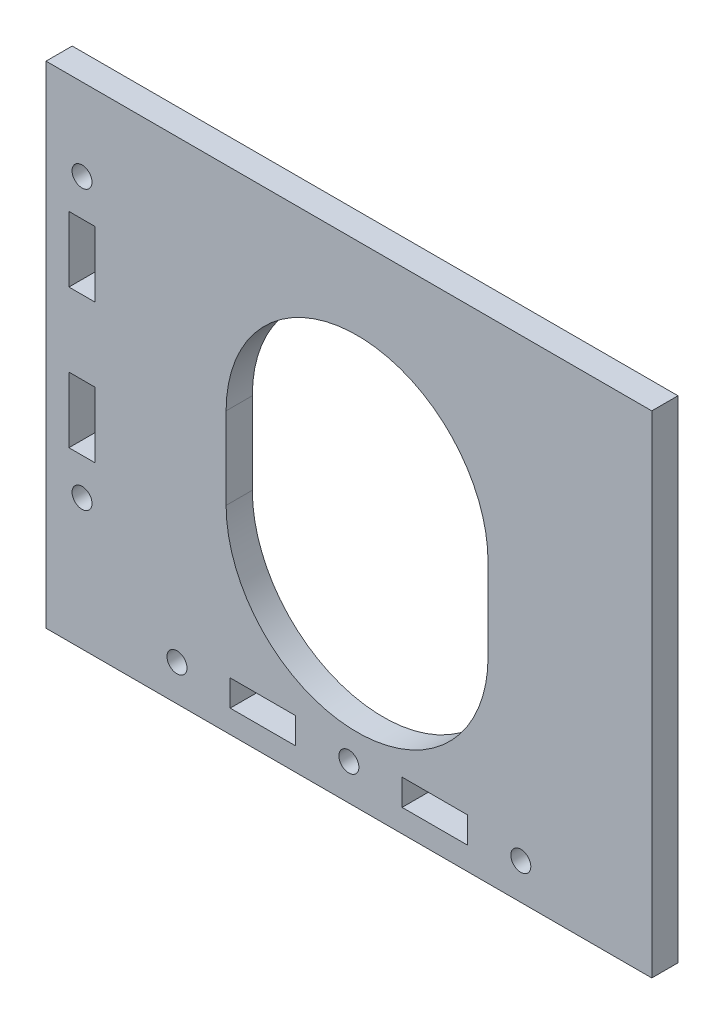
ISO-10303-21;
HEADER;
FILE_DESCRIPTION(('STEP AP214'),'2;1');
FILE_NAME('part.step','',(''),(''),'','','');
FILE_SCHEMA(('AUTOMOTIVE_DESIGN { 1 0 10303 214 1 1 1 1 }'));
ENDSEC;
DATA;
#1=APPLICATION_CONTEXT('core data for automotive mechanical design processes');
#2=APPLICATION_PROTOCOL_DEFINITION('international standard','automotive_design',2000,#1);
#3=PRODUCT_CONTEXT('',#1,'mechanical');
#4=PRODUCT('Part','Part','',(#3));
#5=PRODUCT_RELATED_PRODUCT_CATEGORY('part','',(#4));
#6=PRODUCT_DEFINITION_FORMATION('','',#4);
#7=PRODUCT_DEFINITION_CONTEXT('part definition',#1,'design');
#8=PRODUCT_DEFINITION('design','',#6,#7);
#9=PRODUCT_DEFINITION_SHAPE('','',#8);
#10=(LENGTH_UNIT() NAMED_UNIT(*) SI_UNIT(.MILLI.,.METRE.));
#11=(NAMED_UNIT(*) PLANE_ANGLE_UNIT() SI_UNIT($,.RADIAN.));
#12=(NAMED_UNIT(*) SI_UNIT($,.STERADIAN.) SOLID_ANGLE_UNIT());
#13=UNCERTAINTY_MEASURE_WITH_UNIT(LENGTH_MEASURE(1.E-05),#10,'distance_accuracy_value','');
#14=(GEOMETRIC_REPRESENTATION_CONTEXT(3) GLOBAL_UNCERTAINTY_ASSIGNED_CONTEXT((#13)) GLOBAL_UNIT_ASSIGNED_CONTEXT((#10,
#11,#12)) REPRESENTATION_CONTEXT('',''));
#15=CARTESIAN_POINT('',(0.,0.,0.));
#16=DIRECTION('',(0.,0.,1.));
#17=DIRECTION('',(1.,0.,0.));
#18=AXIS2_PLACEMENT_3D('',#15,#16,#17);
#19=CARTESIAN_POINT('',(0.,0.,8.));
#20=DIRECTION('',(0.,0.,-1.));
#21=DIRECTION('',(-1.,0.,0.));
#22=AXIS2_PLACEMENT_3D('',#19,#20,#21);
#23=PLANE('',#22);
#24=DIRECTION('',(1.,0.,0.));
#25=VECTOR('',#24,1.);
#26=CARTESIAN_POINT('',(0.,78.75,8.));
#27=LINE('',#26,#25);
#28=CARTESIAN_POINT('',(-8.,78.75,8.));
#29=VERTEX_POINT('',#28);
#30=CARTESIAN_POINT('',(0.,78.75,8.));
#31=VERTEX_POINT('',#30);
#32=EDGE_CURVE('E230',#29,#31,#27,.T.);
#33=ORIENTED_EDGE('',*,*,#32,.F.);
#34=DIRECTION('',(0.,-1.,0.));
#35=VECTOR('',#34,1.);
#36=CARTESIAN_POINT('',(-8.,78.75,8.));
#37=LINE('',#36,#35);
#38=CARTESIAN_POINT('',(-8.,98.75,8.));
#39=VERTEX_POINT('',#38);
#40=EDGE_CURVE('E238',#39,#29,#37,.T.);
#41=ORIENTED_EDGE('',*,*,#40,.F.);
#42=DIRECTION('',(-1.,0.,0.));
#43=VECTOR('',#42,1.);
#44=CARTESIAN_POINT('',(-8.,98.75,8.));
#45=LINE('',#44,#43);
#46=CARTESIAN_POINT('',(0.,98.75,8.));
#47=VERTEX_POINT('',#46);
#48=EDGE_CURVE('E235',#47,#39,#45,.T.);
#49=ORIENTED_EDGE('',*,*,#48,.F.);
#50=DIRECTION('',(0.,1.,0.));
#51=VECTOR('',#50,1.);
#52=CARTESIAN_POINT('',(0.,98.75,8.));
#53=LINE('',#52,#51);
#54=EDGE_CURVE('E232',#31,#47,#53,.T.);
#55=ORIENTED_EDGE('',*,*,#54,.F.);
#56=EDGE_LOOP('',(#33,#41,#49,#55));
#57=FACE_BOUND('',#56,.T.);
#58=DIRECTION('',(0.,-1.,0.));
#59=VECTOR('',#58,1.);
#60=CARTESIAN_POINT('',(41.25,-8.,8.));
#61=LINE('',#60,#59);
#62=CARTESIAN_POINT('',(41.25,0.,8.));
#63=VERTEX_POINT('',#62);
#64=CARTESIAN_POINT('',(41.25,-8.,8.));
#65=VERTEX_POINT('',#64);
#66=EDGE_CURVE('E292',#63,#65,#61,.T.);
#67=ORIENTED_EDGE('',*,*,#66,.F.);
#68=DIRECTION('',(-1.,0.,0.));
#69=VECTOR('',#68,1.);
#70=CARTESIAN_POINT('',(41.25,0.,8.));
#71=LINE('',#70,#69);
#72=CARTESIAN_POINT('',(61.25,0.,8.));
#73=VERTEX_POINT('',#72);
#74=EDGE_CURVE('E300',#73,#63,#71,.T.);
#75=ORIENTED_EDGE('',*,*,#74,.F.);
#76=DIRECTION('',(0.,1.,0.));
#77=VECTOR('',#76,1.);
#78=CARTESIAN_POINT('',(61.25,0.,8.));
#79=LINE('',#78,#77);
#80=CARTESIAN_POINT('',(61.25,-8.,8.));
#81=VERTEX_POINT('',#80);
#82=EDGE_CURVE('E297',#81,#73,#79,.T.);
#83=ORIENTED_EDGE('',*,*,#82,.F.);
#84=DIRECTION('',(1.,0.,0.));
#85=VECTOR('',#84,1.);
#86=CARTESIAN_POINT('',(61.25,-8.,8.));
#87=LINE('',#86,#85);
#88=EDGE_CURVE('E294',#65,#81,#87,.T.);
#89=ORIENTED_EDGE('',*,*,#88,.F.);
#90=EDGE_LOOP('',(#67,#75,#83,#89));
#91=FACE_BOUND('',#90,.T.);
#92=CARTESIAN_POINT('',(25.,-4.,8.));
#93=DIRECTION('',(0.,0.,1.));
#94=DIRECTION('',(1.,0.,0.));
#95=AXIS2_PLACEMENT_3D('',#92,#93,#94);
#96=CIRCLE('',#95,3.05);
#97=CARTESIAN_POINT('',(28.05,-4.,8.));
#98=VERTEX_POINT('',#97);
#99=EDGE_CURVE('E329',#98,#98,#96,.T.);
#100=ORIENTED_EDGE('',*,*,#99,.F.);
#101=EDGE_LOOP('',(#100));
#102=FACE_BOUND('',#101,.T.);
#103=CARTESIAN_POINT('',(-4.,110.,8.));
#104=DIRECTION('',(0.,0.,1.));
#105=DIRECTION('',(1.,0.,0.));
#106=AXIS2_PLACEMENT_3D('',#103,#104,#105);
#107=CIRCLE('',#106,3.05);
#108=CARTESIAN_POINT('',(-0.95,110.,8.));
#109=VERTEX_POINT('',#108);
#110=EDGE_CURVE('E341',#109,#109,#107,.T.);
#111=ORIENTED_EDGE('',*,*,#110,.F.);
#112=EDGE_LOOP('',(#111));
#113=FACE_BOUND('',#112,.T.);
#114=CARTESIAN_POINT('',(80.,70.,8.));
#115=DIRECTION('',(0.,0.,1.));
#116=DIRECTION('',(1.,0.,0.));
#117=AXIS2_PLACEMENT_3D('',#114,#115,#116);
#118=CIRCLE('',#117,40.);
#119=CARTESIAN_POINT('',(120.,70.,8.));
#120=VERTEX_POINT('',#119);
#121=CARTESIAN_POINT('',(40.,70.,8.));
#122=VERTEX_POINT('',#121);
#123=EDGE_CURVE('E353',#120,#122,#118,.T.);
#124=ORIENTED_EDGE('',*,*,#123,.F.);
#125=DIRECTION('',(0.,1.,0.));
#126=VECTOR('',#125,1.);
#127=CARTESIAN_POINT('',(120.,70.,8.));
#128=LINE('',#127,#126);
#129=CARTESIAN_POINT('',(120.,45.,8.));
#130=VERTEX_POINT('',#129);
#131=EDGE_CURVE('E361',#130,#120,#128,.T.);
#132=ORIENTED_EDGE('',*,*,#131,.F.);
#133=CARTESIAN_POINT('',(80.,45.,8.));
#134=DIRECTION('',(0.,0.,1.));
#135=DIRECTION('',(1.,0.,0.));
#136=AXIS2_PLACEMENT_3D('',#133,#134,#135);
#137=CIRCLE('',#136,40.);
#138=CARTESIAN_POINT('',(40.,45.,8.));
#139=VERTEX_POINT('',#138);
#140=EDGE_CURVE('E358',#139,#130,#137,.T.);
#141=ORIENTED_EDGE('',*,*,#140,.F.);
#142=DIRECTION('',(0.,-1.,0.));
#143=VECTOR('',#142,1.);
#144=CARTESIAN_POINT('',(40.,45.,8.));
#145=LINE('',#144,#143);
#146=EDGE_CURVE('E355',#122,#139,#145,.T.);
#147=ORIENTED_EDGE('',*,*,#146,.F.);
#148=EDGE_LOOP('',(#124,#132,#141,#147));
#149=FACE_BOUND('',#148,.T.);
#150=DIRECTION('',(1.,0.,0.));
#151=VECTOR('',#150,1.);
#152=CARTESIAN_POINT('',(170.,-15.,8.));
#153=LINE('',#152,#151);
#154=CARTESIAN_POINT('',(-15.,-15.,8.));
#155=VERTEX_POINT('',#154);
#156=CARTESIAN_POINT('',(170.,-15.,8.));
#157=VERTEX_POINT('',#156);
#158=EDGE_CURVE('E384',#155,#157,#153,.T.);
#159=ORIENTED_EDGE('',*,*,#158,.T.);
#160=DIRECTION('',(0.,1.,0.));
#161=VECTOR('',#160,1.);
#162=CARTESIAN_POINT('',(170.,-15.,8.));
#163=LINE('',#162,#161);
#164=CARTESIAN_POINT('',(170.,135.,8.));
#165=VERTEX_POINT('',#164);
#166=EDGE_CURVE('E387',#157,#165,#163,.T.);
#167=ORIENTED_EDGE('',*,*,#166,.T.);
#168=DIRECTION('',(-1.,0.,0.));
#169=VECTOR('',#168,1.);
#170=CARTESIAN_POINT('',(170.,135.,8.));
#171=LINE('',#170,#169);
#172=CARTESIAN_POINT('',(-15.,135.,8.));
#173=VERTEX_POINT('',#172);
#174=EDGE_CURVE('E390',#165,#173,#171,.T.);
#175=ORIENTED_EDGE('',*,*,#174,.T.);
#176=DIRECTION('',(0.,-1.,0.));
#177=VECTOR('',#176,1.);
#178=CARTESIAN_POINT('',(-15.,-15.,8.));
#179=LINE('',#178,#177);
#180=EDGE_CURVE('E392',#173,#155,#179,.T.);
#181=ORIENTED_EDGE('',*,*,#180,.T.);
#182=EDGE_LOOP('',(#159,#167,#175,#181));
#183=FACE_BOUND('',#182,.T.);
#184=CARTESIAN_POINT('',(77.5,-4.,8.));
#185=DIRECTION('',(0.,0.,1.));
#186=DIRECTION('',(1.,0.,0.));
#187=AXIS2_PLACEMENT_3D('',#184,#185,#186);
#188=CIRCLE('',#187,3.05000000000001);
#189=CARTESIAN_POINT('',(80.55,-4.,8.));
#190=VERTEX_POINT('',#189);
#191=EDGE_CURVE('E347',#190,#190,#188,.T.);
#192=ORIENTED_EDGE('',*,*,#191,.F.);
#193=EDGE_LOOP('',(#192));
#194=FACE_BOUND('',#193,.T.);
#195=CARTESIAN_POINT('',(-4.,25.,8.));
#196=DIRECTION('',(0.,0.,1.));
#197=DIRECTION('',(1.,0.,0.));
#198=AXIS2_PLACEMENT_3D('',#195,#196,#197);
#199=CIRCLE('',#198,3.05);
#200=CARTESIAN_POINT('',(-0.95,25.,8.));
#201=VERTEX_POINT('',#200);
#202=EDGE_CURVE('E335',#201,#201,#199,.T.);
#203=ORIENTED_EDGE('',*,*,#202,.F.);
#204=EDGE_LOOP('',(#203));
#205=FACE_BOUND('',#204,.T.);
#206=CARTESIAN_POINT('',(130.,-4.,8.));
#207=DIRECTION('',(0.,0.,1.));
#208=DIRECTION('',(1.,0.,0.));
#209=AXIS2_PLACEMENT_3D('',#206,#207,#208);
#210=CIRCLE('',#209,3.05);
#211=CARTESIAN_POINT('',(133.05,-4.,8.));
#212=VERTEX_POINT('',#211);
#213=EDGE_CURVE('E323',#212,#212,#210,.T.);
#214=ORIENTED_EDGE('',*,*,#213,.F.);
#215=EDGE_LOOP('',(#214));
#216=FACE_BOUND('',#215,.T.);
#217=DIRECTION('',(0.,1.,0.));
#218=VECTOR('',#217,1.);
#219=CARTESIAN_POINT('',(113.75,0.,8.));
#220=LINE('',#219,#218);
#221=CARTESIAN_POINT('',(113.75,-8.,8.));
#222=VERTEX_POINT('',#221);
#223=CARTESIAN_POINT('',(113.75,0.,8.));
#224=VERTEX_POINT('',#223);
#225=EDGE_CURVE('E261',#222,#224,#220,.T.);
#226=ORIENTED_EDGE('',*,*,#225,.F.);
#227=DIRECTION('',(1.,0.,0.));
#228=VECTOR('',#227,1.);
#229=CARTESIAN_POINT('',(113.75,-8.,8.));
#230=LINE('',#229,#228);
#231=CARTESIAN_POINT('',(93.75,-8.,8.));
#232=VERTEX_POINT('',#231);
#233=EDGE_CURVE('E269',#232,#222,#230,.T.);
#234=ORIENTED_EDGE('',*,*,#233,.F.);
#235=DIRECTION('',(0.,-1.,0.));
#236=VECTOR('',#235,1.);
#237=CARTESIAN_POINT('',(93.75,-8.,8.));
#238=LINE('',#237,#236);
#239=CARTESIAN_POINT('',(93.75,0.,8.));
#240=VERTEX_POINT('',#239);
#241=EDGE_CURVE('E266',#240,#232,#238,.T.);
#242=ORIENTED_EDGE('',*,*,#241,.F.);
#243=DIRECTION('',(-1.,0.,0.));
#244=VECTOR('',#243,1.);
#245=CARTESIAN_POINT('',(93.75,0.,8.));
#246=LINE('',#245,#244);
#247=EDGE_CURVE('E263',#224,#240,#246,.T.);
#248=ORIENTED_EDGE('',*,*,#247,.F.);
#249=EDGE_LOOP('',(#226,#234,#242,#248));
#250=FACE_BOUND('',#249,.T.);
#251=DIRECTION('',(1.,0.,0.));
#252=VECTOR('',#251,1.);
#253=CARTESIAN_POINT('',(0.,36.25,8.));
#254=LINE('',#253,#252);
#255=CARTESIAN_POINT('',(-8.,36.25,8.));
#256=VERTEX_POINT('',#255);
#257=CARTESIAN_POINT('',(0.,36.25,8.));
#258=VERTEX_POINT('',#257);
#259=EDGE_CURVE('E194',#256,#258,#254,.T.);
#260=ORIENTED_EDGE('',*,*,#259,.F.);
#261=DIRECTION('',(0.,-1.,0.));
#262=VECTOR('',#261,1.);
#263=CARTESIAN_POINT('',(-8.,36.25,8.));
#264=LINE('',#263,#262);
#265=CARTESIAN_POINT('',(-8.,56.25,8.));
#266=VERTEX_POINT('',#265);
#267=EDGE_CURVE('E216',#266,#256,#264,.T.);
#268=ORIENTED_EDGE('',*,*,#267,.F.);
#269=DIRECTION('',(-1.,0.,0.));
#270=VECTOR('',#269,1.);
#271=CARTESIAN_POINT('',(-8.,56.25,8.));
#272=LINE('',#271,#270);
#273=CARTESIAN_POINT('',(0.,56.25,8.));
#274=VERTEX_POINT('',#273);
#275=EDGE_CURVE('E214',#274,#266,#272,.T.);
#276=ORIENTED_EDGE('',*,*,#275,.F.);
#277=DIRECTION('',(0.,1.,0.));
#278=VECTOR('',#277,1.);
#279=CARTESIAN_POINT('',(0.,56.25,8.));
#280=LINE('',#279,#278);
#281=EDGE_CURVE('E202',#258,#274,#280,.T.);
#282=ORIENTED_EDGE('',*,*,#281,.F.);
#283=EDGE_LOOP('',(#260,#268,#276,#282));
#284=FACE_BOUND('',#283,.T.);
#285=ADVANCED_FACE('F33',(#57,#91,#102,#113,#149,#183,#194,#205,#216,#250,#284),#23,.F.);
#286=CARTESIAN_POINT('',(0.,0.,0.));
#287=DIRECTION('',(0.,0.,-1.));
#288=DIRECTION('',(-1.,0.,0.));
#289=AXIS2_PLACEMENT_3D('',#286,#287,#288);
#290=PLANE('',#289);
#291=DIRECTION('',(0.,-1.,0.));
#292=VECTOR('',#291,1.);
#293=CARTESIAN_POINT('',(-8.,78.75,0.));
#294=LINE('',#293,#292);
#295=CARTESIAN_POINT('',(-8.,98.75,0.));
#296=VERTEX_POINT('',#295);
#297=CARTESIAN_POINT('',(-8.,78.75,0.));
#298=VERTEX_POINT('',#297);
#299=EDGE_CURVE('E233',#296,#298,#294,.T.);
#300=ORIENTED_EDGE('',*,*,#299,.T.);
#301=DIRECTION('',(1.,0.,0.));
#302=VECTOR('',#301,1.);
#303=CARTESIAN_POINT('',(0.,78.75,0.));
#304=LINE('',#303,#302);
#305=CARTESIAN_POINT('',(0.,78.75,0.));
#306=VERTEX_POINT('',#305);
#307=EDGE_CURVE('E210',#298,#306,#304,.T.);
#308=ORIENTED_EDGE('',*,*,#307,.T.);
#309=DIRECTION('',(0.,1.,0.));
#310=VECTOR('',#309,1.);
#311=CARTESIAN_POINT('',(0.,98.75,0.));
#312=LINE('',#311,#310);
#313=CARTESIAN_POINT('',(0.,98.75,0.));
#314=VERTEX_POINT('',#313);
#315=EDGE_CURVE('E243',#306,#314,#312,.T.);
#316=ORIENTED_EDGE('',*,*,#315,.T.);
#317=DIRECTION('',(-1.,0.,0.));
#318=VECTOR('',#317,1.);
#319=CARTESIAN_POINT('',(-8.,98.75,0.));
#320=LINE('',#319,#318);
#321=EDGE_CURVE('E246',#314,#296,#320,.T.);
#322=ORIENTED_EDGE('',*,*,#321,.T.);
#323=EDGE_LOOP('',(#300,#308,#316,#322));
#324=FACE_BOUND('',#323,.T.);
#325=DIRECTION('',(-1.,0.,0.));
#326=VECTOR('',#325,1.);
#327=CARTESIAN_POINT('',(41.25,0.,0.));
#328=LINE('',#327,#326);
#329=CARTESIAN_POINT('',(61.25,0.,0.));
#330=VERTEX_POINT('',#329);
#331=CARTESIAN_POINT('',(41.25,0.,0.));
#332=VERTEX_POINT('',#331);
#333=EDGE_CURVE('E295',#330,#332,#328,.T.);
#334=ORIENTED_EDGE('',*,*,#333,.T.);
#335=DIRECTION('',(0.,-1.,0.));
#336=VECTOR('',#335,1.);
#337=CARTESIAN_POINT('',(41.25,-8.,0.));
#338=LINE('',#337,#336);
#339=CARTESIAN_POINT('',(41.25,-8.,0.));
#340=VERTEX_POINT('',#339);
#341=EDGE_CURVE('E291',#332,#340,#338,.T.);
#342=ORIENTED_EDGE('',*,*,#341,.T.);
#343=DIRECTION('',(1.,0.,0.));
#344=VECTOR('',#343,1.);
#345=CARTESIAN_POINT('',(61.25,-8.,0.));
#346=LINE('',#345,#344);
#347=CARTESIAN_POINT('',(61.25,-8.,0.));
#348=VERTEX_POINT('',#347);
#349=EDGE_CURVE('E305',#340,#348,#346,.T.);
#350=ORIENTED_EDGE('',*,*,#349,.T.);
#351=DIRECTION('',(0.,1.,0.));
#352=VECTOR('',#351,1.);
#353=CARTESIAN_POINT('',(61.25,0.,0.));
#354=LINE('',#353,#352);
#355=EDGE_CURVE('E308',#348,#330,#354,.T.);
#356=ORIENTED_EDGE('',*,*,#355,.T.);
#357=EDGE_LOOP('',(#334,#342,#350,#356));
#358=FACE_BOUND('',#357,.T.);
#359=CARTESIAN_POINT('',(25.,-4.,0.));
#360=DIRECTION('',(0.,0.,1.));
#361=DIRECTION('',(1.,0.,0.));
#362=AXIS2_PLACEMENT_3D('',#359,#360,#361);
#363=CIRCLE('',#362,3.05);
#364=CARTESIAN_POINT('',(28.05,-4.,0.));
#365=VERTEX_POINT('',#364);
#366=EDGE_CURVE('E326',#365,#365,#363,.T.);
#367=ORIENTED_EDGE('',*,*,#366,.T.);
#368=EDGE_LOOP('',(#367));
#369=FACE_BOUND('',#368,.T.);
#370=CARTESIAN_POINT('',(-4.,110.,0.));
#371=DIRECTION('',(0.,0.,1.));
#372=DIRECTION('',(1.,0.,0.));
#373=AXIS2_PLACEMENT_3D('',#370,#371,#372);
#374=CIRCLE('',#373,3.05);
#375=CARTESIAN_POINT('',(-0.95,110.,0.));
#376=VERTEX_POINT('',#375);
#377=EDGE_CURVE('E338',#376,#376,#374,.T.);
#378=ORIENTED_EDGE('',*,*,#377,.T.);
#379=EDGE_LOOP('',(#378));
#380=FACE_BOUND('',#379,.T.);
#381=DIRECTION('',(0.,1.,0.));
#382=VECTOR('',#381,1.);
#383=CARTESIAN_POINT('',(120.,70.,0.));
#384=LINE('',#383,#382);
#385=CARTESIAN_POINT('',(120.,45.,0.));
#386=VERTEX_POINT('',#385);
#387=CARTESIAN_POINT('',(120.,70.,0.));
#388=VERTEX_POINT('',#387);
#389=EDGE_CURVE('E356',#386,#388,#384,.T.);
#390=ORIENTED_EDGE('',*,*,#389,.T.);
#391=CARTESIAN_POINT('',(80.,70.,0.));
#392=DIRECTION('',(0.,0.,1.));
#393=DIRECTION('',(1.,0.,0.));
#394=AXIS2_PLACEMENT_3D('',#391,#392,#393);
#395=CIRCLE('',#394,40.);
#396=CARTESIAN_POINT('',(40.,70.,0.));
#397=VERTEX_POINT('',#396);
#398=EDGE_CURVE('E350',#388,#397,#395,.T.);
#399=ORIENTED_EDGE('',*,*,#398,.T.);
#400=DIRECTION('',(0.,-1.,0.));
#401=VECTOR('',#400,1.);
#402=CARTESIAN_POINT('',(40.,45.,0.));
#403=LINE('',#402,#401);
#404=CARTESIAN_POINT('',(40.,45.,0.));
#405=VERTEX_POINT('',#404);
#406=EDGE_CURVE('E366',#397,#405,#403,.T.);
#407=ORIENTED_EDGE('',*,*,#406,.T.);
#408=CARTESIAN_POINT('',(80.,45.,0.));
#409=DIRECTION('',(0.,0.,1.));
#410=DIRECTION('',(1.,0.,0.));
#411=AXIS2_PLACEMENT_3D('',#408,#409,#410);
#412=CIRCLE('',#411,40.);
#413=EDGE_CURVE('E369',#405,#386,#412,.T.);
#414=ORIENTED_EDGE('',*,*,#413,.T.);
#415=EDGE_LOOP('',(#390,#399,#407,#414));
#416=FACE_BOUND('',#415,.T.);
#417=DIRECTION('',(1.,0.,0.));
#418=VECTOR('',#417,1.);
#419=CARTESIAN_POINT('',(170.,-15.,0.));
#420=LINE('',#419,#418);
#421=CARTESIAN_POINT('',(-15.,-15.,0.));
#422=VERTEX_POINT('',#421);
#423=CARTESIAN_POINT('',(170.,-15.,0.));
#424=VERTEX_POINT('',#423);
#425=EDGE_CURVE('E383',#422,#424,#420,.T.);
#426=ORIENTED_EDGE('',*,*,#425,.F.);
#427=DIRECTION('',(0.,-1.,0.));
#428=VECTOR('',#427,1.);
#429=CARTESIAN_POINT('',(-15.,-15.,0.));
#430=LINE('',#429,#428);
#431=CARTESIAN_POINT('',(-15.,135.,0.));
#432=VERTEX_POINT('',#431);
#433=EDGE_CURVE('E388',#432,#422,#430,.T.);
#434=ORIENTED_EDGE('',*,*,#433,.F.);
#435=DIRECTION('',(-1.,0.,0.));
#436=VECTOR('',#435,1.);
#437=CARTESIAN_POINT('',(170.,135.,0.));
#438=LINE('',#437,#436);
#439=CARTESIAN_POINT('',(170.,135.,0.));
#440=VERTEX_POINT('',#439);
#441=EDGE_CURVE('E399',#440,#432,#438,.T.);
#442=ORIENTED_EDGE('',*,*,#441,.F.);
#443=DIRECTION('',(0.,1.,0.));
#444=VECTOR('',#443,1.);
#445=CARTESIAN_POINT('',(170.,-15.,0.));
#446=LINE('',#445,#444);
#447=EDGE_CURVE('E397',#424,#440,#446,.T.);
#448=ORIENTED_EDGE('',*,*,#447,.F.);
#449=EDGE_LOOP('',(#426,#434,#442,#448));
#450=FACE_BOUND('',#449,.T.);
#451=CARTESIAN_POINT('',(77.5,-4.,0.));
#452=DIRECTION('',(0.,0.,1.));
#453=DIRECTION('',(1.,0.,0.));
#454=AXIS2_PLACEMENT_3D('',#451,#452,#453);
#455=CIRCLE('',#454,3.05000000000001);
#456=CARTESIAN_POINT('',(80.55,-4.,0.));
#457=VERTEX_POINT('',#456);
#458=EDGE_CURVE('E344',#457,#457,#455,.T.);
#459=ORIENTED_EDGE('',*,*,#458,.T.);
#460=EDGE_LOOP('',(#459));
#461=FACE_BOUND('',#460,.T.);
#462=CARTESIAN_POINT('',(-4.,25.,0.));
#463=DIRECTION('',(0.,0.,1.));
#464=DIRECTION('',(1.,0.,0.));
#465=AXIS2_PLACEMENT_3D('',#462,#463,#464);
#466=CIRCLE('',#465,3.05);
#467=CARTESIAN_POINT('',(-0.95,25.,0.));
#468=VERTEX_POINT('',#467);
#469=EDGE_CURVE('E332',#468,#468,#466,.T.);
#470=ORIENTED_EDGE('',*,*,#469,.T.);
#471=EDGE_LOOP('',(#470));
#472=FACE_BOUND('',#471,.T.);
#473=CARTESIAN_POINT('',(130.,-4.,0.));
#474=DIRECTION('',(0.,0.,1.));
#475=DIRECTION('',(1.,0.,0.));
#476=AXIS2_PLACEMENT_3D('',#473,#474,#475);
#477=CIRCLE('',#476,3.05);
#478=CARTESIAN_POINT('',(133.05,-4.,0.));
#479=VERTEX_POINT('',#478);
#480=EDGE_CURVE('E322',#479,#479,#477,.T.);
#481=ORIENTED_EDGE('',*,*,#480,.T.);
#482=EDGE_LOOP('',(#481));
#483=FACE_BOUND('',#482,.T.);
#484=DIRECTION('',(1.,0.,0.));
#485=VECTOR('',#484,1.);
#486=CARTESIAN_POINT('',(113.75,-8.,0.));
#487=LINE('',#486,#485);
#488=CARTESIAN_POINT('',(93.75,-8.,0.));
#489=VERTEX_POINT('',#488);
#490=CARTESIAN_POINT('',(113.75,-8.,0.));
#491=VERTEX_POINT('',#490);
#492=EDGE_CURVE('E264',#489,#491,#487,.T.);
#493=ORIENTED_EDGE('',*,*,#492,.T.);
#494=DIRECTION('',(0.,1.,0.));
#495=VECTOR('',#494,1.);
#496=CARTESIAN_POINT('',(113.75,0.,0.));
#497=LINE('',#496,#495);
#498=CARTESIAN_POINT('',(113.75,0.,0.));
#499=VERTEX_POINT('',#498);
#500=EDGE_CURVE('E260',#491,#499,#497,.T.);
#501=ORIENTED_EDGE('',*,*,#500,.T.);
#502=DIRECTION('',(-1.,0.,0.));
#503=VECTOR('',#502,1.);
#504=CARTESIAN_POINT('',(93.75,0.,0.));
#505=LINE('',#504,#503);
#506=CARTESIAN_POINT('',(93.75,0.,0.));
#507=VERTEX_POINT('',#506);
#508=EDGE_CURVE('E274',#499,#507,#505,.T.);
#509=ORIENTED_EDGE('',*,*,#508,.T.);
#510=DIRECTION('',(0.,-1.,0.));
#511=VECTOR('',#510,1.);
#512=CARTESIAN_POINT('',(93.75,-8.,0.));
#513=LINE('',#512,#511);
#514=EDGE_CURVE('E277',#507,#489,#513,.T.);
#515=ORIENTED_EDGE('',*,*,#514,.T.);
#516=EDGE_LOOP('',(#493,#501,#509,#515));
#517=FACE_BOUND('',#516,.T.);
#518=DIRECTION('',(0.,-1.,0.));
#519=VECTOR('',#518,1.);
#520=CARTESIAN_POINT('',(-8.,36.25,0.));
#521=LINE('',#520,#519);
#522=CARTESIAN_POINT('',(-8.,56.25,0.));
#523=VERTEX_POINT('',#522);
#524=CARTESIAN_POINT('',(-8.,36.25,0.));
#525=VERTEX_POINT('',#524);
#526=EDGE_CURVE('E203',#523,#525,#521,.T.);
#527=ORIENTED_EDGE('',*,*,#526,.T.);
#528=DIRECTION('',(1.,0.,0.));
#529=VECTOR('',#528,1.);
#530=CARTESIAN_POINT('',(0.,36.25,0.));
#531=LINE('',#530,#529);
#532=CARTESIAN_POINT('',(0.,36.25,0.));
#533=VERTEX_POINT('',#532);
#534=EDGE_CURVE('E56',#525,#533,#531,.T.);
#535=ORIENTED_EDGE('',*,*,#534,.T.);
#536=DIRECTION('',(0.,1.,0.));
#537=VECTOR('',#536,1.);
#538=CARTESIAN_POINT('',(0.,56.25,0.));
#539=LINE('',#538,#537);
#540=CARTESIAN_POINT('',(0.,56.25,0.));
#541=VERTEX_POINT('',#540);
#542=EDGE_CURVE('E209',#533,#541,#539,.T.);
#543=ORIENTED_EDGE('',*,*,#542,.T.);
#544=DIRECTION('',(-1.,0.,0.));
#545=VECTOR('',#544,1.);
#546=CARTESIAN_POINT('',(-8.,56.25,0.));
#547=LINE('',#546,#545);
#548=EDGE_CURVE('E222',#541,#523,#547,.T.);
#549=ORIENTED_EDGE('',*,*,#548,.T.);
#550=EDGE_LOOP('',(#527,#535,#543,#549));
#551=FACE_BOUND('',#550,.T.);
#552=ADVANCED_FACE('F417',(#324,#358,#369,#380,#416,#450,#461,#472,#483,#517,#551),#290,.T.);
#553=CARTESIAN_POINT('',(170.,-15.,8.));
#554=DIRECTION('',(0.,1.,0.));
#555=DIRECTION('',(-1.,0.,0.));
#556=AXIS2_PLACEMENT_3D('',#553,#554,#555);
#557=PLANE('',#556);
#558=ORIENTED_EDGE('',*,*,#425,.T.);
#559=DIRECTION('',(0.,0.,-1.));
#560=VECTOR('',#559,1.);
#561=CARTESIAN_POINT('',(170.,-15.,8.));
#562=LINE('',#561,#560);
#563=EDGE_CURVE('E11',#157,#424,#562,.T.);
#564=ORIENTED_EDGE('',*,*,#563,.F.);
#565=ORIENTED_EDGE('',*,*,#158,.F.);
#566=DIRECTION('',(0.,0.,-1.));
#567=VECTOR('',#566,1.);
#568=CARTESIAN_POINT('',(-15.,-15.,8.));
#569=LINE('',#568,#567);
#570=EDGE_CURVE('E394',#155,#422,#569,.T.);
#571=ORIENTED_EDGE('',*,*,#570,.T.);
#572=EDGE_LOOP('',(#558,#564,#565,#571));
#573=FACE_BOUND('',#572,.T.);
#574=ADVANCED_FACE('F35',(#573),#557,.F.);
#575=CARTESIAN_POINT('',(170.,-15.,8.));
#576=DIRECTION('',(-1.,0.,0.));
#577=DIRECTION('',(0.,0.,1.));
#578=AXIS2_PLACEMENT_3D('',#575,#576,#577);
#579=PLANE('',#578);
#580=ORIENTED_EDGE('',*,*,#447,.T.);
#581=DIRECTION('',(0.,0.,-1.));
#582=VECTOR('',#581,1.);
#583=CARTESIAN_POINT('',(170.,135.,8.));
#584=LINE('',#583,#582);
#585=EDGE_CURVE('E41',#165,#440,#584,.T.);
#586=ORIENTED_EDGE('',*,*,#585,.F.);
#587=ORIENTED_EDGE('',*,*,#166,.F.);
#588=ORIENTED_EDGE('',*,*,#563,.T.);
#589=EDGE_LOOP('',(#580,#586,#587,#588));
#590=FACE_BOUND('',#589,.T.);
#591=ADVANCED_FACE('F428',(#590),#579,.F.);
#592=CARTESIAN_POINT('',(170.,135.,8.));
#593=DIRECTION('',(0.,-1.,0.));
#594=DIRECTION('',(1.,0.,0.));
#595=AXIS2_PLACEMENT_3D('',#592,#593,#594);
#596=PLANE('',#595);
#597=ORIENTED_EDGE('',*,*,#441,.T.);
#598=DIRECTION('',(0.,0.,-1.));
#599=VECTOR('',#598,1.);
#600=CARTESIAN_POINT('',(-15.,135.,8.));
#601=LINE('',#600,#599);
#602=EDGE_CURVE('E404',#173,#432,#601,.T.);
#603=ORIENTED_EDGE('',*,*,#602,.F.);
#604=ORIENTED_EDGE('',*,*,#174,.F.);
#605=ORIENTED_EDGE('',*,*,#585,.T.);
#606=EDGE_LOOP('',(#597,#603,#604,#605));
#607=FACE_BOUND('',#606,.T.);
#608=ADVANCED_FACE('F411',(#607),#596,.F.);
#609=CARTESIAN_POINT('',(-15.,-15.,8.));
#610=DIRECTION('',(1.,0.,0.));
#611=DIRECTION('',(0.,0.,-1.));
#612=AXIS2_PLACEMENT_3D('',#609,#610,#611);
#613=PLANE('',#612);
#614=ORIENTED_EDGE('',*,*,#433,.T.);
#615=ORIENTED_EDGE('',*,*,#570,.F.);
#616=ORIENTED_EDGE('',*,*,#180,.F.);
#617=ORIENTED_EDGE('',*,*,#602,.T.);
#618=EDGE_LOOP('',(#614,#615,#616,#617));
#619=FACE_BOUND('',#618,.T.);
#620=ADVANCED_FACE('F421',(#619),#613,.F.);
#621=CARTESIAN_POINT('',(80.,70.,8.));
#622=DIRECTION('',(0.,0.,-1.));
#623=DIRECTION('',(-1.,0.,0.));
#624=AXIS2_PLACEMENT_3D('',#621,#622,#623);
#625=CYLINDRICAL_SURFACE('',#624,40.);
#626=ORIENTED_EDGE('',*,*,#398,.F.);
#627=DIRECTION('',(0.,0.,-1.));
#628=VECTOR('',#627,1.);
#629=CARTESIAN_POINT('',(120.,70.,8.));
#630=LINE('',#629,#628);
#631=EDGE_CURVE('E363',#120,#388,#630,.T.);
#632=ORIENTED_EDGE('',*,*,#631,.F.);
#633=ORIENTED_EDGE('',*,*,#123,.T.);
#634=DIRECTION('',(0.,0.,-1.));
#635=VECTOR('',#634,1.);
#636=CARTESIAN_POINT('',(40.,70.,8.));
#637=LINE('',#636,#635);
#638=EDGE_CURVE('E380',#122,#397,#637,.T.);
#639=ORIENTED_EDGE('',*,*,#638,.T.);
#640=EDGE_LOOP('',(#626,#632,#633,#639));
#641=FACE_BOUND('',#640,.T.);
#642=ADVANCED_FACE('F446',(#641),#625,.F.);
#643=CARTESIAN_POINT('',(40.,45.,8.));
#644=DIRECTION('',(1.,0.,0.));
#645=DIRECTION('',(0.,0.,-1.));
#646=AXIS2_PLACEMENT_3D('',#643,#644,#645);
#647=PLANE('',#646);
#648=ORIENTED_EDGE('',*,*,#406,.F.);
#649=ORIENTED_EDGE('',*,*,#638,.F.);
#650=ORIENTED_EDGE('',*,*,#146,.T.);
#651=DIRECTION('',(0.,0.,-1.));
#652=VECTOR('',#651,1.);
#653=CARTESIAN_POINT('',(40.,45.,8.));
#654=LINE('',#653,#652);
#655=EDGE_CURVE('E378',#139,#405,#654,.T.);
#656=ORIENTED_EDGE('',*,*,#655,.T.);
#657=EDGE_LOOP('',(#648,#649,#650,#656));
#658=FACE_BOUND('',#657,.T.);
#659=ADVANCED_FACE('F453',(#658),#647,.T.);
#660=CARTESIAN_POINT('',(80.,45.,8.));
#661=DIRECTION('',(0.,0.,-1.));
#662=DIRECTION('',(-1.,0.,0.));
#663=AXIS2_PLACEMENT_3D('',#660,#661,#662);
#664=CYLINDRICAL_SURFACE('',#663,40.);
#665=ORIENTED_EDGE('',*,*,#413,.F.);
#666=ORIENTED_EDGE('',*,*,#655,.F.);
#667=ORIENTED_EDGE('',*,*,#140,.T.);
#668=DIRECTION('',(0.,0.,-1.));
#669=VECTOR('',#668,1.);
#670=CARTESIAN_POINT('',(120.,45.,8.));
#671=LINE('',#670,#669);
#672=EDGE_CURVE('E376',#130,#386,#671,.T.);
#673=ORIENTED_EDGE('',*,*,#672,.T.);
#674=EDGE_LOOP('',(#665,#666,#667,#673));
#675=FACE_BOUND('',#674,.T.);
#676=ADVANCED_FACE('F458',(#675),#664,.F.);
#677=CARTESIAN_POINT('',(120.,70.,8.));
#678=DIRECTION('',(-1.,0.,0.));
#679=DIRECTION('',(0.,0.,1.));
#680=AXIS2_PLACEMENT_3D('',#677,#678,#679);
#681=PLANE('',#680);
#682=ORIENTED_EDGE('',*,*,#389,.F.);
#683=ORIENTED_EDGE('',*,*,#672,.F.);
#684=ORIENTED_EDGE('',*,*,#131,.T.);
#685=ORIENTED_EDGE('',*,*,#631,.T.);
#686=EDGE_LOOP('',(#682,#683,#684,#685));
#687=FACE_BOUND('',#686,.T.);
#688=ADVANCED_FACE('F466',(#687),#681,.T.);
#689=CARTESIAN_POINT('',(77.5,-4.,8.));
#690=DIRECTION('',(0.,0.,-1.));
#691=DIRECTION('',(-1.,0.,0.));
#692=AXIS2_PLACEMENT_3D('',#689,#690,#691);
#693=CYLINDRICAL_SURFACE('',#692,3.05000000000001);
#694=ORIENTED_EDGE('',*,*,#191,.T.);
#695=EDGE_LOOP('',(#694));
#696=FACE_BOUND('',#695,.T.);
#697=ORIENTED_EDGE('',*,*,#458,.F.);
#698=EDGE_LOOP('',(#697));
#699=FACE_BOUND('',#698,.T.);
#700=ADVANCED_FACE('F479',(#696,#699),#693,.F.);
#701=CARTESIAN_POINT('',(-4.,110.,8.));
#702=DIRECTION('',(0.,0.,-1.));
#703=DIRECTION('',(-1.,0.,0.));
#704=AXIS2_PLACEMENT_3D('',#701,#702,#703);
#705=CYLINDRICAL_SURFACE('',#704,3.05);
#706=ORIENTED_EDGE('',*,*,#110,.T.);
#707=EDGE_LOOP('',(#706));
#708=FACE_BOUND('',#707,.T.);
#709=ORIENTED_EDGE('',*,*,#377,.F.);
#710=EDGE_LOOP('',(#709));
#711=FACE_BOUND('',#710,.T.);
#712=ADVANCED_FACE('F484',(#708,#711),#705,.F.);
#713=CARTESIAN_POINT('',(-4.,25.,8.));
#714=DIRECTION('',(0.,0.,-1.));
#715=DIRECTION('',(-1.,0.,0.));
#716=AXIS2_PLACEMENT_3D('',#713,#714,#715);
#717=CYLINDRICAL_SURFACE('',#716,3.05);
#718=ORIENTED_EDGE('',*,*,#202,.T.);
#719=EDGE_LOOP('',(#718));
#720=FACE_BOUND('',#719,.T.);
#721=ORIENTED_EDGE('',*,*,#469,.F.);
#722=EDGE_LOOP('',(#721));
#723=FACE_BOUND('',#722,.T.);
#724=ADVANCED_FACE('F488',(#720,#723),#717,.F.);
#725=CARTESIAN_POINT('',(25.,-4.,8.));
#726=DIRECTION('',(0.,0.,-1.));
#727=DIRECTION('',(-1.,0.,0.));
#728=AXIS2_PLACEMENT_3D('',#725,#726,#727);
#729=CYLINDRICAL_SURFACE('',#728,3.05);
#730=ORIENTED_EDGE('',*,*,#99,.T.);
#731=EDGE_LOOP('',(#730));
#732=FACE_BOUND('',#731,.T.);
#733=ORIENTED_EDGE('',*,*,#366,.F.);
#734=EDGE_LOOP('',(#733));
#735=FACE_BOUND('',#734,.T.);
#736=ADVANCED_FACE('F492',(#732,#735),#729,.F.);
#737=CARTESIAN_POINT('',(130.,-4.,8.));
#738=DIRECTION('',(0.,0.,-1.));
#739=DIRECTION('',(-1.,0.,0.));
#740=AXIS2_PLACEMENT_3D('',#737,#738,#739);
#741=CYLINDRICAL_SURFACE('',#740,3.05);
#742=ORIENTED_EDGE('',*,*,#213,.T.);
#743=EDGE_LOOP('',(#742));
#744=FACE_BOUND('',#743,.T.);
#745=ORIENTED_EDGE('',*,*,#480,.F.);
#746=EDGE_LOOP('',(#745));
#747=FACE_BOUND('',#746,.T.);
#748=ADVANCED_FACE('F496',(#744,#747),#741,.F.);
#749=CARTESIAN_POINT('',(41.25,-8.,8.));
#750=DIRECTION('',(1.,0.,0.));
#751=DIRECTION('',(0.,0.,-1.));
#752=AXIS2_PLACEMENT_3D('',#749,#750,#751);
#753=PLANE('',#752);
#754=ORIENTED_EDGE('',*,*,#341,.F.);
#755=DIRECTION('',(0.,0.,-1.));
#756=VECTOR('',#755,1.);
#757=CARTESIAN_POINT('',(41.25,0.,8.));
#758=LINE('',#757,#756);
#759=EDGE_CURVE('E302',#63,#332,#758,.T.);
#760=ORIENTED_EDGE('',*,*,#759,.F.);
#761=ORIENTED_EDGE('',*,*,#66,.T.);
#762=DIRECTION('',(0.,0.,-1.));
#763=VECTOR('',#762,1.);
#764=CARTESIAN_POINT('',(41.25,-8.,8.));
#765=LINE('',#764,#763);
#766=EDGE_CURVE('E319',#65,#340,#765,.T.);
#767=ORIENTED_EDGE('',*,*,#766,.T.);
#768=EDGE_LOOP('',(#754,#760,#761,#767));
#769=FACE_BOUND('',#768,.T.);
#770=ADVANCED_FACE('F500',(#769),#753,.T.);
#771=CARTESIAN_POINT('',(61.25,-8.,8.));
#772=DIRECTION('',(0.,1.,0.));
#773=DIRECTION('',(0.,0.,1.));
#774=AXIS2_PLACEMENT_3D('',#771,#772,#773);
#775=PLANE('',#774);
#776=ORIENTED_EDGE('',*,*,#349,.F.);
#777=ORIENTED_EDGE('',*,*,#766,.F.);
#778=ORIENTED_EDGE('',*,*,#88,.T.);
#779=DIRECTION('',(0.,0.,-1.));
#780=VECTOR('',#779,1.);
#781=CARTESIAN_POINT('',(61.25,-8.,8.));
#782=LINE('',#781,#780);
#783=EDGE_CURVE('E317',#81,#348,#782,.T.);
#784=ORIENTED_EDGE('',*,*,#783,.T.);
#785=EDGE_LOOP('',(#776,#777,#778,#784));
#786=FACE_BOUND('',#785,.T.);
#787=ADVANCED_FACE('F504',(#786),#775,.T.);
#788=CARTESIAN_POINT('',(61.25,0.,8.));
#789=DIRECTION('',(-1.,0.,0.));
#790=DIRECTION('',(0.,0.,1.));
#791=AXIS2_PLACEMENT_3D('',#788,#789,#790);
#792=PLANE('',#791);
#793=ORIENTED_EDGE('',*,*,#355,.F.);
#794=ORIENTED_EDGE('',*,*,#783,.F.);
#795=ORIENTED_EDGE('',*,*,#82,.T.);
#796=DIRECTION('',(0.,0.,-1.));
#797=VECTOR('',#796,1.);
#798=CARTESIAN_POINT('',(61.25,0.,8.));
#799=LINE('',#798,#797);
#800=EDGE_CURVE('E315',#73,#330,#799,.T.);
#801=ORIENTED_EDGE('',*,*,#800,.T.);
#802=EDGE_LOOP('',(#793,#794,#795,#801));
#803=FACE_BOUND('',#802,.T.);
#804=ADVANCED_FACE('F508',(#803),#792,.T.);
#805=CARTESIAN_POINT('',(41.25,0.,8.));
#806=DIRECTION('',(0.,-1.,0.));
#807=DIRECTION('',(0.,0.,-1.));
#808=AXIS2_PLACEMENT_3D('',#805,#806,#807);
#809=PLANE('',#808);
#810=ORIENTED_EDGE('',*,*,#333,.F.);
#811=ORIENTED_EDGE('',*,*,#800,.F.);
#812=ORIENTED_EDGE('',*,*,#74,.T.);
#813=ORIENTED_EDGE('',*,*,#759,.T.);
#814=EDGE_LOOP('',(#810,#811,#812,#813));
#815=FACE_BOUND('',#814,.T.);
#816=ADVANCED_FACE('F512',(#815),#809,.T.);
#817=CARTESIAN_POINT('',(113.75,0.,8.));
#818=DIRECTION('',(-1.,0.,0.));
#819=DIRECTION('',(0.,0.,1.));
#820=AXIS2_PLACEMENT_3D('',#817,#818,#819);
#821=PLANE('',#820);
#822=ORIENTED_EDGE('',*,*,#500,.F.);
#823=DIRECTION('',(0.,0.,-1.));
#824=VECTOR('',#823,1.);
#825=CARTESIAN_POINT('',(113.75,-8.,8.));
#826=LINE('',#825,#824);
#827=EDGE_CURVE('E271',#222,#491,#826,.T.);
#828=ORIENTED_EDGE('',*,*,#827,.F.);
#829=ORIENTED_EDGE('',*,*,#225,.T.);
#830=DIRECTION('',(0.,0.,-1.));
#831=VECTOR('',#830,1.);
#832=CARTESIAN_POINT('',(113.75,0.,8.));
#833=LINE('',#832,#831);
#834=EDGE_CURVE('E288',#224,#499,#833,.T.);
#835=ORIENTED_EDGE('',*,*,#834,.T.);
#836=EDGE_LOOP('',(#822,#828,#829,#835));
#837=FACE_BOUND('',#836,.T.);
#838=ADVANCED_FACE('F516',(#837),#821,.T.);
#839=CARTESIAN_POINT('',(93.75,0.,8.));
#840=DIRECTION('',(0.,-1.,0.));
#841=DIRECTION('',(0.,0.,-1.));
#842=AXIS2_PLACEMENT_3D('',#839,#840,#841);
#843=PLANE('',#842);
#844=ORIENTED_EDGE('',*,*,#508,.F.);
#845=ORIENTED_EDGE('',*,*,#834,.F.);
#846=ORIENTED_EDGE('',*,*,#247,.T.);
#847=DIRECTION('',(0.,0.,-1.));
#848=VECTOR('',#847,1.);
#849=CARTESIAN_POINT('',(93.75,0.,8.));
#850=LINE('',#849,#848);
#851=EDGE_CURVE('E286',#240,#507,#850,.T.);
#852=ORIENTED_EDGE('',*,*,#851,.T.);
#853=EDGE_LOOP('',(#844,#845,#846,#852));
#854=FACE_BOUND('',#853,.T.);
#855=ADVANCED_FACE('F520',(#854),#843,.T.);
#856=CARTESIAN_POINT('',(93.75,-8.,8.));
#857=DIRECTION('',(1.,0.,0.));
#858=DIRECTION('',(0.,0.,-1.));
#859=AXIS2_PLACEMENT_3D('',#856,#857,#858);
#860=PLANE('',#859);
#861=ORIENTED_EDGE('',*,*,#514,.F.);
#862=ORIENTED_EDGE('',*,*,#851,.F.);
#863=ORIENTED_EDGE('',*,*,#241,.T.);
#864=DIRECTION('',(0.,0.,-1.));
#865=VECTOR('',#864,1.);
#866=CARTESIAN_POINT('',(93.75,-8.,8.));
#867=LINE('',#866,#865);
#868=EDGE_CURVE('E284',#232,#489,#867,.T.);
#869=ORIENTED_EDGE('',*,*,#868,.T.);
#870=EDGE_LOOP('',(#861,#862,#863,#869));
#871=FACE_BOUND('',#870,.T.);
#872=ADVANCED_FACE('F524',(#871),#860,.T.);
#873=CARTESIAN_POINT('',(113.75,-8.,8.));
#874=DIRECTION('',(0.,1.,0.));
#875=DIRECTION('',(0.,0.,1.));
#876=AXIS2_PLACEMENT_3D('',#873,#874,#875);
#877=PLANE('',#876);
#878=ORIENTED_EDGE('',*,*,#492,.F.);
#879=ORIENTED_EDGE('',*,*,#868,.F.);
#880=ORIENTED_EDGE('',*,*,#233,.T.);
#881=ORIENTED_EDGE('',*,*,#827,.T.);
#882=EDGE_LOOP('',(#878,#879,#880,#881));
#883=FACE_BOUND('',#882,.T.);
#884=ADVANCED_FACE('F528',(#883),#877,.T.);
#885=CARTESIAN_POINT('',(0.,78.75,8.));
#886=DIRECTION('',(0.,1.,0.));
#887=DIRECTION('',(0.,0.,1.));
#888=AXIS2_PLACEMENT_3D('',#885,#886,#887);
#889=PLANE('',#888);
#890=ORIENTED_EDGE('',*,*,#307,.F.);
#891=DIRECTION('',(0.,0.,-1.));
#892=VECTOR('',#891,1.);
#893=CARTESIAN_POINT('',(-8.,78.75,8.));
#894=LINE('',#893,#892);
#895=EDGE_CURVE('E240',#29,#298,#894,.T.);
#896=ORIENTED_EDGE('',*,*,#895,.F.);
#897=ORIENTED_EDGE('',*,*,#32,.T.);
#898=DIRECTION('',(0.,0.,-1.));
#899=VECTOR('',#898,1.);
#900=CARTESIAN_POINT('',(0.,78.75,8.));
#901=LINE('',#900,#899);
#902=EDGE_CURVE('E257',#31,#306,#901,.T.);
#903=ORIENTED_EDGE('',*,*,#902,.T.);
#904=EDGE_LOOP('',(#890,#896,#897,#903));
#905=FACE_BOUND('',#904,.T.);
#906=ADVANCED_FACE('F532',(#905),#889,.T.);
#907=CARTESIAN_POINT('',(0.,98.75,8.));
#908=DIRECTION('',(-1.,0.,0.));
#909=DIRECTION('',(0.,0.,1.));
#910=AXIS2_PLACEMENT_3D('',#907,#908,#909);
#911=PLANE('',#910);
#912=ORIENTED_EDGE('',*,*,#315,.F.);
#913=ORIENTED_EDGE('',*,*,#902,.F.);
#914=ORIENTED_EDGE('',*,*,#54,.T.);
#915=DIRECTION('',(0.,0.,-1.));
#916=VECTOR('',#915,1.);
#917=CARTESIAN_POINT('',(0.,98.75,8.));
#918=LINE('',#917,#916);
#919=EDGE_CURVE('E255',#47,#314,#918,.T.);
#920=ORIENTED_EDGE('',*,*,#919,.T.);
#921=EDGE_LOOP('',(#912,#913,#914,#920));
#922=FACE_BOUND('',#921,.T.);
#923=ADVANCED_FACE('F536',(#922),#911,.T.);
#924=CARTESIAN_POINT('',(-8.,98.75,8.));
#925=DIRECTION('',(0.,-1.,0.));
#926=DIRECTION('',(0.,0.,-1.));
#927=AXIS2_PLACEMENT_3D('',#924,#925,#926);
#928=PLANE('',#927);
#929=ORIENTED_EDGE('',*,*,#321,.F.);
#930=ORIENTED_EDGE('',*,*,#919,.F.);
#931=ORIENTED_EDGE('',*,*,#48,.T.);
#932=DIRECTION('',(0.,0.,-1.));
#933=VECTOR('',#932,1.);
#934=CARTESIAN_POINT('',(-8.,98.75,8.));
#935=LINE('',#934,#933);
#936=EDGE_CURVE('E253',#39,#296,#935,.T.);
#937=ORIENTED_EDGE('',*,*,#936,.T.);
#938=EDGE_LOOP('',(#929,#930,#931,#937));
#939=FACE_BOUND('',#938,.T.);
#940=ADVANCED_FACE('F540',(#939),#928,.T.);
#941=CARTESIAN_POINT('',(-8.,78.75,8.));
#942=DIRECTION('',(1.,0.,0.));
#943=DIRECTION('',(0.,0.,-1.));
#944=AXIS2_PLACEMENT_3D('',#941,#942,#943);
#945=PLANE('',#944);
#946=ORIENTED_EDGE('',*,*,#299,.F.);
#947=ORIENTED_EDGE('',*,*,#936,.F.);
#948=ORIENTED_EDGE('',*,*,#40,.T.);
#949=ORIENTED_EDGE('',*,*,#895,.T.);
#950=EDGE_LOOP('',(#946,#947,#948,#949));
#951=FACE_BOUND('',#950,.T.);
#952=ADVANCED_FACE('F544',(#951),#945,.T.);
#953=CARTESIAN_POINT('',(0.,36.25,8.));
#954=DIRECTION('',(0.,1.,0.));
#955=DIRECTION('',(0.,0.,1.));
#956=AXIS2_PLACEMENT_3D('',#953,#954,#955);
#957=PLANE('',#956);
#958=ORIENTED_EDGE('',*,*,#534,.F.);
#959=DIRECTION('',(0.,0.,-1.));
#960=VECTOR('',#959,1.);
#961=CARTESIAN_POINT('',(-8.,36.25,8.));
#962=LINE('',#961,#960);
#963=EDGE_CURVE('E198',#256,#525,#962,.T.);
#964=ORIENTED_EDGE('',*,*,#963,.F.);
#965=ORIENTED_EDGE('',*,*,#259,.T.);
#966=DIRECTION('',(0.,0.,-1.));
#967=VECTOR('',#966,1.);
#968=CARTESIAN_POINT('',(0.,36.25,8.));
#969=LINE('',#968,#967);
#970=EDGE_CURVE('E197',#258,#533,#969,.T.);
#971=ORIENTED_EDGE('',*,*,#970,.T.);
#972=EDGE_LOOP('',(#958,#964,#965,#971));
#973=FACE_BOUND('',#972,.T.);
#974=ADVANCED_FACE('F196',(#973),#957,.T.);
#975=CARTESIAN_POINT('',(0.,56.25,8.));
#976=DIRECTION('',(-1.,0.,0.));
#977=DIRECTION('',(0.,0.,1.));
#978=AXIS2_PLACEMENT_3D('',#975,#976,#977);
#979=PLANE('',#978);
#980=ORIENTED_EDGE('',*,*,#542,.F.);
#981=ORIENTED_EDGE('',*,*,#970,.F.);
#982=ORIENTED_EDGE('',*,*,#281,.T.);
#983=DIRECTION('',(0.,0.,-1.));
#984=VECTOR('',#983,1.);
#985=CARTESIAN_POINT('',(0.,56.25,8.));
#986=LINE('',#985,#984);
#987=EDGE_CURVE('E211',#274,#541,#986,.T.);
#988=ORIENTED_EDGE('',*,*,#987,.T.);
#989=EDGE_LOOP('',(#980,#981,#982,#988));
#990=FACE_BOUND('',#989,.T.);
#991=ADVANCED_FACE('F206',(#990),#979,.T.);
#992=CARTESIAN_POINT('',(-8.,56.25,8.));
#993=DIRECTION('',(0.,-1.,0.));
#994=DIRECTION('',(0.,0.,-1.));
#995=AXIS2_PLACEMENT_3D('',#992,#993,#994);
#996=PLANE('',#995);
#997=ORIENTED_EDGE('',*,*,#548,.F.);
#998=ORIENTED_EDGE('',*,*,#987,.F.);
#999=ORIENTED_EDGE('',*,*,#275,.T.);
#1000=DIRECTION('',(0.,0.,-1.));
#1001=VECTOR('',#1000,1.);
#1002=CARTESIAN_POINT('',(-8.,56.25,8.));
#1003=LINE('',#1002,#1001);
#1004=EDGE_CURVE('E48',#266,#523,#1003,.T.);
#1005=ORIENTED_EDGE('',*,*,#1004,.T.);
#1006=EDGE_LOOP('',(#997,#998,#999,#1005));
#1007=FACE_BOUND('',#1006,.T.);
#1008=ADVANCED_FACE('F553',(#1007),#996,.T.);
#1009=CARTESIAN_POINT('',(-8.,36.25,8.));
#1010=DIRECTION('',(1.,0.,0.));
#1011=DIRECTION('',(0.,0.,-1.));
#1012=AXIS2_PLACEMENT_3D('',#1009,#1010,#1011);
#1013=PLANE('',#1012);
#1014=ORIENTED_EDGE('',*,*,#526,.F.);
#1015=ORIENTED_EDGE('',*,*,#1004,.F.);
#1016=ORIENTED_EDGE('',*,*,#267,.T.);
#1017=ORIENTED_EDGE('',*,*,#963,.T.);
#1018=EDGE_LOOP('',(#1014,#1015,#1016,#1017));
#1019=FACE_BOUND('',#1018,.T.);
#1020=ADVANCED_FACE('F556',(#1019),#1013,.T.);
#1021=CLOSED_SHELL('',(#285,#552,#574,#591,#608,#620,#642,#659,#676,#688,#700,#712,#724,#736,
#748,#770,#787,#804,#816,#838,#855,#872,#884,#906,#923,#940,#952,#974,#991,#1008,#1020));
#1022=MANIFOLD_SOLID_BREP('B2',#1021);
#1023=ADVANCED_BREP_SHAPE_REPRESENTATION('',(#18,#1022),#14);
#1024=SHAPE_DEFINITION_REPRESENTATION(#9,#1023);
ENDSEC;
END-ISO-10303-21;
